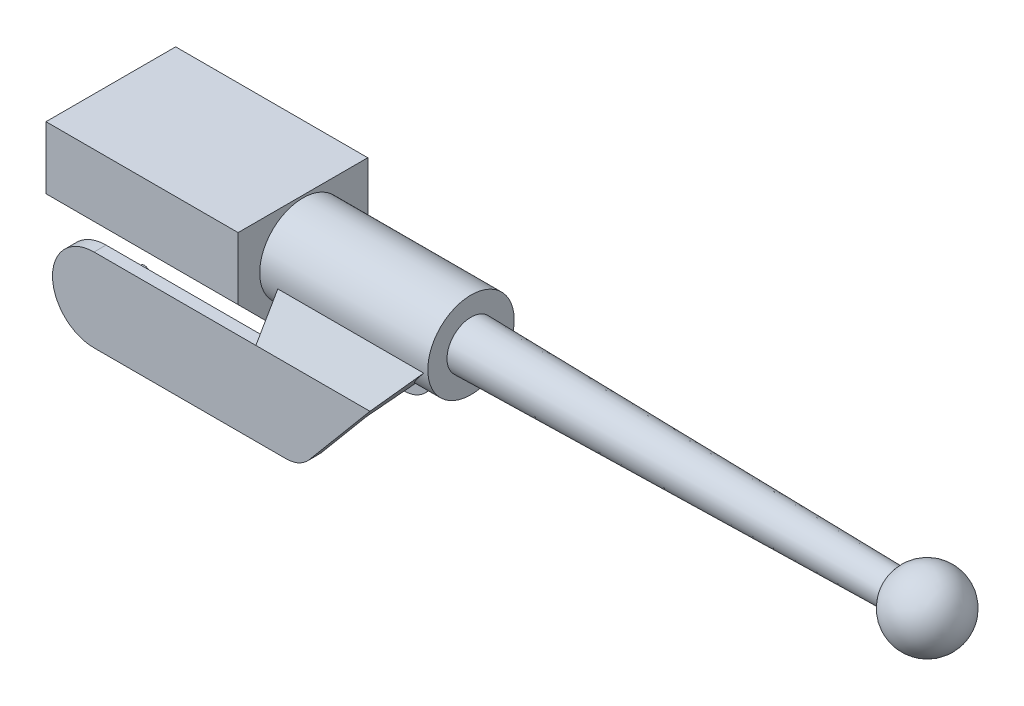
ISO-10303-21;
HEADER;
FILE_DESCRIPTION(('STEP AP214'),'2;1');
FILE_NAME('part.step','',(''),(''),'','','');
FILE_SCHEMA(('AUTOMOTIVE_DESIGN { 1 0 10303 214 1 1 1 1 }'));
ENDSEC;
DATA;
#1=APPLICATION_CONTEXT('core data for automotive mechanical design processes');
#2=APPLICATION_PROTOCOL_DEFINITION('international standard','automotive_design',2000,#1);
#3=PRODUCT_CONTEXT('',#1,'mechanical');
#4=PRODUCT('Part','Part','',(#3));
#5=PRODUCT_RELATED_PRODUCT_CATEGORY('part','',(#4));
#6=PRODUCT_DEFINITION_FORMATION('','',#4);
#7=PRODUCT_DEFINITION_CONTEXT('part definition',#1,'design');
#8=PRODUCT_DEFINITION('design','',#6,#7);
#9=PRODUCT_DEFINITION_SHAPE('','',#8);
#10=(LENGTH_UNIT() NAMED_UNIT(*) SI_UNIT(.MILLI.,.METRE.));
#11=(NAMED_UNIT(*) PLANE_ANGLE_UNIT() SI_UNIT($,.RADIAN.));
#12=(NAMED_UNIT(*) SI_UNIT($,.STERADIAN.) SOLID_ANGLE_UNIT());
#13=UNCERTAINTY_MEASURE_WITH_UNIT(LENGTH_MEASURE(1.E-05),#10,'distance_accuracy_value','');
#14=(GEOMETRIC_REPRESENTATION_CONTEXT(3) GLOBAL_UNCERTAINTY_ASSIGNED_CONTEXT((#13)) GLOBAL_UNIT_ASSIGNED_CONTEXT((#10,
#11,#12)) REPRESENTATION_CONTEXT('',''));
#15=CARTESIAN_POINT('',(0.,0.,0.));
#16=DIRECTION('',(0.,0.,1.));
#17=DIRECTION('',(1.,0.,0.));
#18=AXIS2_PLACEMENT_3D('',#15,#16,#17);
#19=CARTESIAN_POINT('',(-750.,-127.283333109177,110.));
#20=DIRECTION('',(0.,0.,1.));
#21=DIRECTION('',(0.,-1.,0.));
#22=AXIS2_PLACEMENT_3D('',#19,#20,#21);
#23=PLANE('',#22);
#24=CARTESIAN_POINT('',(-250.,-200.,110.));
#25=DIRECTION('',(0.,0.,1.));
#26=DIRECTION('',(0.,-1.,0.));
#27=AXIS2_PLACEMENT_3D('',#24,#25,#26);
#28=CIRCLE('',#27,62.953588842435);
#29=CARTESIAN_POINT('',(-250.,-262.953588842435,110.));
#30=VERTEX_POINT('',#29);
#31=CARTESIAN_POINT('',(-201.774753092856,-240.465786893218,110.));
#32=VERTEX_POINT('',#31);
#33=EDGE_CURVE('E225',#30,#32,#28,.T.);
#34=ORIENTED_EDGE('',*,*,#33,.F.);
#35=DIRECTION('',(-1.,0.,0.));
#36=VECTOR('',#35,1.);
#37=CARTESIAN_POINT('',(-250.,-262.953588842435,110.));
#38=LINE('',#37,#36);
#39=CARTESIAN_POINT('',(-650.,-262.953588842435,110.));
#40=VERTEX_POINT('',#39);
#41=EDGE_CURVE('E213',#30,#40,#38,.T.);
#42=ORIENTED_EDGE('',*,*,#41,.T.);
#43=CARTESIAN_POINT('',(-650.,-176.476794421218,110.));
#44=DIRECTION('',(0.,0.,1.));
#45=DIRECTION('',(0.,-1.,0.));
#46=AXIS2_PLACEMENT_3D('',#43,#44,#45);
#47=CIRCLE('',#46,86.4767944212173);
#48=CARTESIAN_POINT('',(-650.,-90.,110.));
#49=VERTEX_POINT('',#48);
#50=EDGE_CURVE('E367',#40,#49,#47,.F.);
#51=ORIENTED_EDGE('',*,*,#50,.T.);
#52=DIRECTION('',(1.,0.,0.));
#53=VECTOR('',#52,1.);
#54=CARTESIAN_POINT('',(-650.,-90.,110.));
#55=LINE('',#54,#53);
#56=CARTESIAN_POINT('',(-312.953588842435,-90.,110.));
#57=VERTEX_POINT('',#56);
#58=EDGE_CURVE('E196',#49,#57,#55,.T.);
#59=ORIENTED_EDGE('',*,*,#58,.T.);
#60=DIRECTION('',(0.,-1.,0.));
#61=VECTOR('',#60,1.);
#62=CARTESIAN_POINT('',(-312.953588842435,0.,110.));
#63=LINE('',#62,#61);
#64=CARTESIAN_POINT('',(-312.953588842435,-127.283333109177,110.));
#65=VERTEX_POINT('',#64);
#66=EDGE_CURVE('E52',#57,#65,#63,.T.);
#67=ORIENTED_EDGE('',*,*,#66,.T.);
#68=DIRECTION('',(1.,0.,0.));
#69=VECTOR('',#68,1.);
#70=CARTESIAN_POINT('',(-750.,-127.283333109177,110.));
#71=LINE('',#70,#69);
#72=CARTESIAN_POINT('',(-106.803397866926,-127.283333109177,110.));
#73=VERTEX_POINT('',#72);
#74=EDGE_CURVE('E216',#65,#73,#71,.T.);
#75=ORIENTED_EDGE('',*,*,#74,.T.);
#76=DIRECTION('',(0.642787609686544,0.766044443118975,0.));
#77=VECTOR('',#76,1.);
#78=CARTESIAN_POINT('',(-201.774753092856,-240.465786893218,110.));
#79=LINE('',#78,#77);
#80=EDGE_CURVE('E227',#32,#73,#79,.T.);
#81=ORIENTED_EDGE('',*,*,#80,.F.);
#82=EDGE_LOOP('',(#34,#42,#51,#59,#67,#75,#81));
#83=FACE_BOUND('',#82,.T.);
#84=CARTESIAN_POINT('',(-650.,-176.476794421218,110.));
#85=DIRECTION('',(0.,0.,1.));
#86=DIRECTION('',(1.,0.,0.));
#87=AXIS2_PLACEMENT_3D('',#84,#85,#86);
#88=CIRCLE('',#87,10.);
#89=CARTESIAN_POINT('',(-640.,-176.476794421218,110.));
#90=VERTEX_POINT('',#89);
#91=EDGE_CURVE('E373',#90,#90,#88,.T.);
#92=ORIENTED_EDGE('',*,*,#91,.T.);
#93=EDGE_LOOP('',(#92));
#94=FACE_BOUND('',#93,.T.);
#95=CARTESIAN_POINT('',(-250.,-200.,110.));
#96=DIRECTION('',(0.,0.,1.));
#97=DIRECTION('',(0.,-1.,0.));
#98=AXIS2_PLACEMENT_3D('',#95,#96,#97);
#99=CIRCLE('',#98,15.);
#100=CARTESIAN_POINT('',(-250.,-215.,110.));
#101=VERTEX_POINT('',#100);
#102=EDGE_CURVE('E12',#101,#101,#99,.F.);
#103=ORIENTED_EDGE('',*,*,#102,.F.);
#104=EDGE_LOOP('',(#103));
#105=FACE_BOUND('',#104,.T.);
#106=ADVANCED_FACE('F36',(#83,#94,#105),#23,.F.);
#107=CARTESIAN_POINT('',(0.,0.,0.));
#108=DIRECTION('',(1.,0.,0.));
#109=DIRECTION('',(0.,0.,-1.));
#110=AXIS2_PLACEMENT_3D('',#107,#108,#109);
#111=PLANE('',#110);
#112=CARTESIAN_POINT('',(0.,0.,0.));
#113=DIRECTION('',(1.,0.,0.));
#114=DIRECTION('',(0.,0.,-1.));
#115=AXIS2_PLACEMENT_3D('',#112,#113,#114);
#116=CIRCLE('',#115,90.);
#117=CARTESIAN_POINT('',(0.,0.,-90.));
#118=VERTEX_POINT('',#117);
#119=EDGE_CURVE('E311',#118,#118,#116,.T.);
#120=ORIENTED_EDGE('',*,*,#119,.T.);
#121=EDGE_LOOP('',(#120));
#122=FACE_BOUND('',#121,.T.);
#123=CARTESIAN_POINT('',(0.,0.,0.));
#124=DIRECTION('',(1.,0.,0.));
#125=DIRECTION('',(0.,0.,-1.));
#126=AXIS2_PLACEMENT_3D('',#123,#124,#125);
#127=CIRCLE('',#126,50.);
#128=CARTESIAN_POINT('',(0.,0.,-50.));
#129=VERTEX_POINT('',#128);
#130=EDGE_CURVE('E189',#129,#129,#127,.T.);
#131=ORIENTED_EDGE('',*,*,#130,.F.);
#132=EDGE_LOOP('',(#131));
#133=FACE_BOUND('',#132,.T.);
#134=ADVANCED_FACE('F399',(#122,#133),#111,.T.);
#135=CARTESIAN_POINT('',(-350.,0.,0.));
#136=DIRECTION('',(1.,0.,0.));
#137=DIRECTION('',(0.,0.,-1.));
#138=AXIS2_PLACEMENT_3D('',#135,#136,#137);
#139=CYLINDRICAL_SURFACE('',#138,90.);
#140=DIRECTION('',(1.,0.,0.));
#141=VECTOR('',#140,1.);
#142=CARTESIAN_POINT('',(-350.,-10.9084534613157,89.3364743152667));
#143=LINE('',#142,#141);
#144=CARTESIAN_POINT('',(-9.15327927610456,-10.9084534613157,89.3364743152667));
#145=VERTEX_POINT('',#144);
#146=CARTESIAN_POINT('',(-312.953588842435,-10.9084534613157,89.3364743152667));
#147=VERTEX_POINT('',#146);
#148=EDGE_CURVE('E274',#145,#147,#143,.F.);
#149=ORIENTED_EDGE('',*,*,#148,.F.);
#150=CARTESIAN_POINT('',(0.,0.,0.));
#151=DIRECTION('',(-0.766044443118975,0.642787609686543,0.));
#152=DIRECTION('',(0.642787609686544,0.766044443118975,0.));
#153=AXIS2_PLACEMENT_3D('',#150,#151,#152);
#154=ELLIPSE('',#153,117.486656039906,90.);
#155=CARTESIAN_POINT('',(-60.1565780546724,-71.6918180148291,54.4084849056526));
#156=VERTEX_POINT('',#155);
#157=EDGE_CURVE('E281',#145,#156,#154,.F.);
#158=ORIENTED_EDGE('',*,*,#157,.T.);
#159=DIRECTION('',(1.,0.,0.));
#160=VECTOR('',#159,1.);
#161=CARTESIAN_POINT('',(-350.,-71.6918180148291,54.4084849056526));
#162=LINE('',#161,#160);
#163=CARTESIAN_POINT('',(-312.953588842435,-71.6918180148291,54.4084849056526));
#164=VERTEX_POINT('',#163);
#165=EDGE_CURVE('E338',#156,#164,#162,.F.);
#166=ORIENTED_EDGE('',*,*,#165,.T.);
#167=CARTESIAN_POINT('',(-312.953588842435,0.,0.));
#168=DIRECTION('',(1.,0.,0.));
#169=DIRECTION('',(0.,0.,-1.));
#170=AXIS2_PLACEMENT_3D('',#167,#168,#169);
#171=CIRCLE('',#170,90.);
#172=EDGE_CURVE('E45',#164,#147,#171,.F.);
#173=ORIENTED_EDGE('',*,*,#172,.T.);
#174=EDGE_LOOP('',(#149,#158,#166,#173));
#175=FACE_BOUND('',#174,.T.);
#176=DIRECTION('',(1.,0.,0.));
#177=VECTOR('',#176,1.);
#178=CARTESIAN_POINT('',(-350.,-10.9084534613157,-89.3364743152667));
#179=LINE('',#178,#177);
#180=CARTESIAN_POINT('',(-312.953588842435,-10.9084534613157,-89.3364743152667));
#181=VERTEX_POINT('',#180);
#182=CARTESIAN_POINT('',(-9.15327927610464,-10.9084534613157,-89.3364743152667));
#183=VERTEX_POINT('',#182);
#184=EDGE_CURVE('E276',#181,#183,#179,.T.);
#185=ORIENTED_EDGE('',*,*,#184,.F.);
#186=CARTESIAN_POINT('',(-312.953588842435,-74.3017038301033,-50.7863840802199));
#187=VERTEX_POINT('',#186);
#188=EDGE_CURVE('E335',#181,#187,#171,.F.);
#189=ORIENTED_EDGE('',*,*,#188,.T.);
#190=DIRECTION('',(1.,0.,0.));
#191=VECTOR('',#190,1.);
#192=CARTESIAN_POINT('',(-350.,-74.3017038301033,-50.7863840802199));
#193=LINE('',#192,#191);
#194=CARTESIAN_POINT('',(-62.3465322796838,-74.3017038301033,-50.7863840802199));
#195=VERTEX_POINT('',#194);
#196=EDGE_CURVE('E332',#187,#195,#193,.T.);
#197=ORIENTED_EDGE('',*,*,#196,.T.);
#198=EDGE_CURVE('E278',#195,#183,#154,.F.);
#199=ORIENTED_EDGE('',*,*,#198,.T.);
#200=EDGE_LOOP('',(#185,#189,#197,#199));
#201=FACE_BOUND('',#200,.T.);
#202=CARTESIAN_POINT('',(-350.,0.,0.));
#203=DIRECTION('',(1.,0.,0.));
#204=DIRECTION('',(0.,0.,-1.));
#205=AXIS2_PLACEMENT_3D('',#202,#203,#204);
#206=CIRCLE('',#205,90.);
#207=CARTESIAN_POINT('',(-350.,0.,-90.));
#208=VERTEX_POINT('',#207);
#209=EDGE_CURVE('E308',#208,#208,#206,.F.);
#210=ORIENTED_EDGE('',*,*,#209,.F.);
#211=EDGE_LOOP('',(#210));
#212=FACE_BOUND('',#211,.T.);
#213=ORIENTED_EDGE('',*,*,#119,.F.);
#214=EDGE_LOOP('',(#213));
#215=FACE_BOUND('',#214,.T.);
#216=ADVANCED_FACE('F345',(#175,#201,#212,#215),#139,.T.);
#217=CARTESIAN_POINT('',(-750.,-95.,135.));
#218=DIRECTION('',(0.,0.,-1.));
#219=DIRECTION('',(-1.,0.,0.));
#220=AXIS2_PLACEMENT_3D('',#217,#218,#219);
#221=PLANE('',#220);
#222=DIRECTION('',(0.,1.,0.));
#223=VECTOR('',#222,1.);
#224=CARTESIAN_POINT('',(-750.,-95.,135.));
#225=LINE('',#224,#223);
#226=CARTESIAN_POINT('',(-750.,-35.,135.));
#227=VERTEX_POINT('',#226);
#228=CARTESIAN_POINT('',(-750.,95.,135.));
#229=VERTEX_POINT('',#228);
#230=EDGE_CURVE('E282',#227,#229,#225,.T.);
#231=ORIENTED_EDGE('',*,*,#230,.F.);
#232=DIRECTION('',(1.,0.,0.));
#233=VECTOR('',#232,1.);
#234=CARTESIAN_POINT('',(-750.,-35.,135.));
#235=LINE('',#234,#233);
#236=CARTESIAN_POINT('',(-350.,-35.,135.));
#237=VERTEX_POINT('',#236);
#238=EDGE_CURVE('E329',#227,#237,#235,.T.);
#239=ORIENTED_EDGE('',*,*,#238,.T.);
#240=DIRECTION('',(0.,1.,0.));
#241=VECTOR('',#240,1.);
#242=CARTESIAN_POINT('',(-350.,-95.,135.));
#243=LINE('',#242,#241);
#244=CARTESIAN_POINT('',(-350.,95.,135.));
#245=VERTEX_POINT('',#244);
#246=EDGE_CURVE('E294',#237,#245,#243,.T.);
#247=ORIENTED_EDGE('',*,*,#246,.T.);
#248=DIRECTION('',(1.,0.,0.));
#249=VECTOR('',#248,1.);
#250=CARTESIAN_POINT('',(-750.,95.,135.));
#251=LINE('',#250,#249);
#252=EDGE_CURVE('E305',#229,#245,#251,.T.);
#253=ORIENTED_EDGE('',*,*,#252,.F.);
#254=EDGE_LOOP('',(#231,#239,#247,#253));
#255=FACE_BOUND('',#254,.T.);
#256=ADVANCED_FACE('F462',(#255),#221,.F.);
#257=CARTESIAN_POINT('',(-750.,95.,-135.));
#258=DIRECTION('',(0.,-1.,0.));
#259=DIRECTION('',(0.,0.,-1.));
#260=AXIS2_PLACEMENT_3D('',#257,#258,#259);
#261=PLANE('',#260);
#262=DIRECTION('',(0.,0.,-1.));
#263=VECTOR('',#262,1.);
#264=CARTESIAN_POINT('',(-350.,95.,-135.));
#265=LINE('',#264,#263);
#266=CARTESIAN_POINT('',(-350.,95.,-135.));
#267=VERTEX_POINT('',#266);
#268=EDGE_CURVE('E296',#245,#267,#265,.T.);
#269=ORIENTED_EDGE('',*,*,#268,.T.);
#270=DIRECTION('',(1.,0.,0.));
#271=VECTOR('',#270,1.);
#272=CARTESIAN_POINT('',(-750.,95.,-135.));
#273=LINE('',#272,#271);
#274=CARTESIAN_POINT('',(-750.,95.,-135.));
#275=VERTEX_POINT('',#274);
#276=EDGE_CURVE('E293',#275,#267,#273,.T.);
#277=ORIENTED_EDGE('',*,*,#276,.F.);
#278=DIRECTION('',(0.,0.,-1.));
#279=VECTOR('',#278,1.);
#280=CARTESIAN_POINT('',(-750.,95.,-135.));
#281=LINE('',#280,#279);
#282=EDGE_CURVE('E284',#229,#275,#281,.T.);
#283=ORIENTED_EDGE('',*,*,#282,.F.);
#284=ORIENTED_EDGE('',*,*,#252,.T.);
#285=EDGE_LOOP('',(#269,#277,#283,#284));
#286=FACE_BOUND('',#285,.T.);
#287=ADVANCED_FACE('F458',(#286),#261,.F.);
#288=CARTESIAN_POINT('',(-750.,-95.,-135.));
#289=DIRECTION('',(0.,0.,1.));
#290=DIRECTION('',(1.,0.,0.));
#291=AXIS2_PLACEMENT_3D('',#288,#289,#290);
#292=PLANE('',#291);
#293=DIRECTION('',(0.,-1.,0.));
#294=VECTOR('',#293,1.);
#295=CARTESIAN_POINT('',(-350.,-95.,-135.));
#296=LINE('',#295,#294);
#297=CARTESIAN_POINT('',(-350.,-35.,-135.));
#298=VERTEX_POINT('',#297);
#299=EDGE_CURVE('E298',#267,#298,#296,.T.);
#300=ORIENTED_EDGE('',*,*,#299,.T.);
#301=DIRECTION('',(-1.,0.,0.));
#302=VECTOR('',#301,1.);
#303=CARTESIAN_POINT('',(-750.,-35.,-135.));
#304=LINE('',#303,#302);
#305=CARTESIAN_POINT('',(-750.,-35.,-135.));
#306=VERTEX_POINT('',#305);
#307=EDGE_CURVE('E323',#298,#306,#304,.T.);
#308=ORIENTED_EDGE('',*,*,#307,.T.);
#309=DIRECTION('',(0.,-1.,0.));
#310=VECTOR('',#309,1.);
#311=CARTESIAN_POINT('',(-750.,-95.,-135.));
#312=LINE('',#311,#310);
#313=EDGE_CURVE('E287',#275,#306,#312,.T.);
#314=ORIENTED_EDGE('',*,*,#313,.F.);
#315=ORIENTED_EDGE('',*,*,#276,.T.);
#316=EDGE_LOOP('',(#300,#308,#314,#315));
#317=FACE_BOUND('',#316,.T.);
#318=ADVANCED_FACE('F454',(#317),#292,.F.);
#319=CARTESIAN_POINT('',(-750.,-95.,-135.));
#320=DIRECTION('',(0.,1.,0.));
#321=DIRECTION('',(0.,0.,1.));
#322=AXIS2_PLACEMENT_3D('',#319,#320,#321);
#323=PLANE('',#322);
#324=DIRECTION('',(0.,0.,1.));
#325=VECTOR('',#324,1.);
#326=CARTESIAN_POINT('',(-750.,-95.,-135.));
#327=LINE('',#326,#325);
#328=CARTESIAN_POINT('',(-750.,-95.,-75.));
#329=VERTEX_POINT('',#328);
#330=CARTESIAN_POINT('',(-750.,-95.,75.));
#331=VERTEX_POINT('',#330);
#332=EDGE_CURVE('E290',#329,#331,#327,.T.);
#333=ORIENTED_EDGE('',*,*,#332,.F.);
#334=DIRECTION('',(1.,0.,0.));
#335=VECTOR('',#334,1.);
#336=CARTESIAN_POINT('',(-750.,-95.,-75.));
#337=LINE('',#336,#335);
#338=CARTESIAN_POINT('',(-350.,-95.,-75.));
#339=VERTEX_POINT('',#338);
#340=EDGE_CURVE('E316',#329,#339,#337,.T.);
#341=ORIENTED_EDGE('',*,*,#340,.T.);
#342=DIRECTION('',(0.,0.,1.));
#343=VECTOR('',#342,1.);
#344=CARTESIAN_POINT('',(-350.,-95.,-135.));
#345=LINE('',#344,#343);
#346=CARTESIAN_POINT('',(-350.,-95.,75.));
#347=VERTEX_POINT('',#346);
#348=EDGE_CURVE('E285',#339,#347,#345,.T.);
#349=ORIENTED_EDGE('',*,*,#348,.T.);
#350=DIRECTION('',(-1.,0.,0.));
#351=VECTOR('',#350,1.);
#352=CARTESIAN_POINT('',(-750.,-95.,75.));
#353=LINE('',#352,#351);
#354=EDGE_CURVE('E314',#347,#331,#353,.T.);
#355=ORIENTED_EDGE('',*,*,#354,.T.);
#356=EDGE_LOOP('',(#333,#341,#349,#355));
#357=FACE_BOUND('',#356,.T.);
#358=ADVANCED_FACE('F446',(#357),#323,.F.);
#359=CARTESIAN_POINT('',(-750.,95.,135.));
#360=DIRECTION('',(1.,0.,0.));
#361=DIRECTION('',(0.,0.,-1.));
#362=AXIS2_PLACEMENT_3D('',#359,#360,#361);
#363=PLANE('',#362);
#364=ORIENTED_EDGE('',*,*,#313,.T.);
#365=DIRECTION('',(0.,0.707106781186549,-0.707106781186546));
#366=VECTOR('',#365,1.);
#367=CARTESIAN_POINT('',(-750.,-95.,-75.));
#368=LINE('',#367,#366);
#369=EDGE_CURVE('E327',#306,#329,#368,.F.);
#370=ORIENTED_EDGE('',*,*,#369,.T.);
#371=ORIENTED_EDGE('',*,*,#332,.T.);
#372=DIRECTION('',(0.,-0.707106781186546,-0.707106781186549));
#373=VECTOR('',#372,1.);
#374=CARTESIAN_POINT('',(-750.,-35.,135.));
#375=LINE('',#374,#373);
#376=EDGE_CURVE('E325',#331,#227,#375,.F.);
#377=ORIENTED_EDGE('',*,*,#376,.T.);
#378=ORIENTED_EDGE('',*,*,#230,.T.);
#379=ORIENTED_EDGE('',*,*,#282,.T.);
#380=EDGE_LOOP('',(#364,#370,#371,#377,#378,#379));
#381=FACE_BOUND('',#380,.T.);
#382=ADVANCED_FACE('F442',(#381),#363,.F.);
#383=CARTESIAN_POINT('',(-350.,95.,135.));
#384=DIRECTION('',(1.,0.,0.));
#385=DIRECTION('',(0.,0.,-1.));
#386=AXIS2_PLACEMENT_3D('',#383,#384,#385);
#387=PLANE('',#386);
#388=ORIENTED_EDGE('',*,*,#209,.T.);
#389=EDGE_LOOP('',(#388));
#390=FACE_BOUND('',#389,.T.);
#391=ORIENTED_EDGE('',*,*,#348,.F.);
#392=DIRECTION('',(0.,-0.707106781186549,0.707106781186546));
#393=VECTOR('',#392,1.);
#394=CARTESIAN_POINT('',(-350.,-105.,-65.));
#395=LINE('',#394,#393);
#396=EDGE_CURVE('E321',#339,#298,#395,.F.);
#397=ORIENTED_EDGE('',*,*,#396,.T.);
#398=ORIENTED_EDGE('',*,*,#299,.F.);
#399=ORIENTED_EDGE('',*,*,#268,.F.);
#400=ORIENTED_EDGE('',*,*,#246,.F.);
#401=DIRECTION('',(0.,0.707106781186546,0.707106781186549));
#402=VECTOR('',#401,1.);
#403=CARTESIAN_POINT('',(-350.,30.,200.));
#404=LINE('',#403,#402);
#405=EDGE_CURVE('E319',#237,#347,#404,.F.);
#406=ORIENTED_EDGE('',*,*,#405,.T.);
#407=EDGE_LOOP('',(#391,#397,#398,#399,#400,#406));
#408=FACE_BOUND('',#407,.T.);
#409=ADVANCED_FACE('F445',(#390,#408),#387,.T.);
#410=CARTESIAN_POINT('',(-750.,-95.,-75.));
#411=DIRECTION('',(0.,0.707106781186546,0.707106781186549));
#412=DIRECTION('',(0.,-0.707106781186549,0.707106781186546));
#413=AXIS2_PLACEMENT_3D('',#410,#411,#412);
#414=PLANE('',#413);
#415=ORIENTED_EDGE('',*,*,#369,.F.);
#416=ORIENTED_EDGE('',*,*,#307,.F.);
#417=ORIENTED_EDGE('',*,*,#396,.F.);
#418=ORIENTED_EDGE('',*,*,#340,.F.);
#419=EDGE_LOOP('',(#415,#416,#417,#418));
#420=FACE_BOUND('',#419,.T.);
#421=ADVANCED_FACE('F450',(#420),#414,.F.);
#422=CARTESIAN_POINT('',(-750.,-35.,135.));
#423=DIRECTION('',(0.,0.707106781186549,-0.707106781186546));
#424=DIRECTION('',(0.,0.707106781186546,0.707106781186549));
#425=AXIS2_PLACEMENT_3D('',#422,#423,#424);
#426=PLANE('',#425);
#427=ORIENTED_EDGE('',*,*,#376,.F.);
#428=ORIENTED_EDGE('',*,*,#354,.F.);
#429=ORIENTED_EDGE('',*,*,#405,.F.);
#430=ORIENTED_EDGE('',*,*,#238,.F.);
#431=EDGE_LOOP('',(#427,#428,#429,#430));
#432=FACE_BOUND('',#431,.T.);
#433=ADVANCED_FACE('F415',(#432),#426,.F.);
#434=CARTESIAN_POINT('',(-750.,-133.515319749884,-110.));
#435=DIRECTION('',(0.,0.707106781186544,-0.707106781186551));
#436=DIRECTION('',(0.,0.707106781186551,0.707106781186544));
#437=AXIS2_PLACEMENT_3D('',#434,#435,#436);
#438=PLANE('',#437);
#439=ORIENTED_EDGE('',*,*,#196,.F.);
#440=DIRECTION('',(0.,0.707106781186551,0.707106781186544));
#441=VECTOR('',#440,1.);
#442=CARTESIAN_POINT('',(-312.953588842435,55.7423401250586,79.2576598749407));
#443=LINE('',#442,#441);
#444=CARTESIAN_POINT('',(-312.953588842435,-133.515319749884,-110.));
#445=VERTEX_POINT('',#444);
#446=EDGE_CURVE('E266',#445,#187,#443,.T.);
#447=ORIENTED_EDGE('',*,*,#446,.F.);
#448=DIRECTION('',(1.,0.,0.));
#449=VECTOR('',#448,1.);
#450=CARTESIAN_POINT('',(-750.,-133.515319749884,-110.));
#451=LINE('',#450,#449);
#452=CARTESIAN_POINT('',(-112.032655558646,-133.515319749884,-110.));
#453=VERTEX_POINT('',#452);
#454=EDGE_CURVE('E215',#445,#453,#451,.T.);
#455=ORIENTED_EDGE('',*,*,#454,.T.);
#456=DIRECTION('',(-0.510273605374743,-0.608120402411344,-0.608120402411337));
#457=VECTOR('',#456,1.);
#458=CARTESIAN_POINT('',(-92.5617813595415,-110.310835472152,-86.7955157222684));
#459=LINE('',#458,#457);
#460=EDGE_CURVE('E218',#195,#453,#459,.T.);
#461=ORIENTED_EDGE('',*,*,#460,.F.);
#462=EDGE_LOOP('',(#439,#447,#455,#461));
#463=FACE_BOUND('',#462,.T.);
#464=ADVANCED_FACE('F411',(#463),#438,.F.);
#465=CARTESIAN_POINT('',(-750.,-133.515319749884,-110.));
#466=DIRECTION('',(0.,0.,-1.));
#467=DIRECTION('',(0.,1.,0.));
#468=AXIS2_PLACEMENT_3D('',#465,#466,#467);
#469=PLANE('',#468);
#470=CARTESIAN_POINT('',(-250.,-200.,-110.));
#471=DIRECTION('',(0.,0.,-1.));
#472=DIRECTION('',(-1.,0.,0.));
#473=AXIS2_PLACEMENT_3D('',#470,#471,#472);
#474=CIRCLE('',#473,15.);
#475=CARTESIAN_POINT('',(-265.,-200.,-110.));
#476=VERTEX_POINT('',#475);
#477=EDGE_CURVE('E380',#476,#476,#474,.T.);
#478=ORIENTED_EDGE('',*,*,#477,.T.);
#479=EDGE_LOOP('',(#478));
#480=FACE_BOUND('',#479,.T.);
#481=ORIENTED_EDGE('',*,*,#454,.F.);
#482=DIRECTION('',(0.,1.,0.));
#483=VECTOR('',#482,1.);
#484=CARTESIAN_POINT('',(-312.953588842435,0.,-110.));
#485=LINE('',#484,#483);
#486=CARTESIAN_POINT('',(-312.953588842435,-200.,-110.));
#487=VERTEX_POINT('',#486);
#488=EDGE_CURVE('E271',#487,#445,#485,.T.);
#489=ORIENTED_EDGE('',*,*,#488,.F.);
#490=CARTESIAN_POINT('',(-250.,-200.,-110.));
#491=DIRECTION('',(0.,0.,-1.));
#492=DIRECTION('',(0.,1.,0.));
#493=AXIS2_PLACEMENT_3D('',#490,#491,#492);
#494=CIRCLE('',#493,62.953588842435);
#495=CARTESIAN_POINT('',(-201.774753092856,-240.465786893218,-110.));
#496=VERTEX_POINT('',#495);
#497=EDGE_CURVE('E230',#496,#487,#494,.T.);
#498=ORIENTED_EDGE('',*,*,#497,.F.);
#499=DIRECTION('',(-0.642787609686544,-0.766044443118975,0.));
#500=VECTOR('',#499,1.);
#501=CARTESIAN_POINT('',(-201.774753092856,-240.465786893218,-110.));
#502=LINE('',#501,#500);
#503=EDGE_CURVE('E232',#453,#496,#502,.T.);
#504=ORIENTED_EDGE('',*,*,#503,.F.);
#505=EDGE_LOOP('',(#481,#489,#498,#504));
#506=FACE_BOUND('',#505,.T.);
#507=ADVANCED_FACE('F414',(#480,#506),#469,.F.);
#508=CARTESIAN_POINT('',(0.,0.,-83.0384757729337));
#509=DIRECTION('',(0.,-0.5,0.86602540378444));
#510=DIRECTION('',(0.,-0.86602540378444,-0.5));
#511=AXIS2_PLACEMENT_3D('',#508,#509,#510);
#512=PLANE('',#511);
#513=DIRECTION('',(0.,0.86602540378444,0.5));
#514=VECTOR('',#513,1.);
#515=CARTESIAN_POINT('',(-312.953588842435,0.,-83.0384757729337));
#516=LINE('',#515,#514);
#517=CARTESIAN_POINT('',(-312.953588842435,-90.,-135.));
#518=VERTEX_POINT('',#517);
#519=EDGE_CURVE('E256',#181,#518,#516,.F.);
#520=ORIENTED_EDGE('',*,*,#519,.F.);
#521=ORIENTED_EDGE('',*,*,#184,.T.);
#522=DIRECTION('',(-0.58785888315256,-0.700582935935475,-0.404481746652002));
#523=VECTOR('',#522,1.);
#524=CARTESIAN_POINT('',(0.,0.,-83.0384757729337));
#525=LINE('',#524,#523);
#526=CARTESIAN_POINT('',(-75.5189668059561,-90.,-135.));
#527=VERTEX_POINT('',#526);
#528=EDGE_CURVE('E262',#527,#183,#525,.F.);
#529=ORIENTED_EDGE('',*,*,#528,.F.);
#530=DIRECTION('',(1.,0.,0.));
#531=VECTOR('',#530,1.);
#532=CARTESIAN_POINT('',(-250.,-90.,-135.));
#533=LINE('',#532,#531);
#534=EDGE_CURVE('E258',#518,#527,#533,.T.);
#535=ORIENTED_EDGE('',*,*,#534,.F.);
#536=EDGE_LOOP('',(#520,#521,#529,#535));
#537=FACE_BOUND('',#536,.T.);
#538=ADVANCED_FACE('F419',(#537),#512,.F.);
#539=CARTESIAN_POINT('',(-250.,-200.,-135.));
#540=DIRECTION('',(0.,0.,1.));
#541=DIRECTION('',(1.,0.,0.));
#542=AXIS2_PLACEMENT_3D('',#539,#540,#541);
#543=PLANE('',#542);
#544=DIRECTION('',(0.,-1.,0.));
#545=VECTOR('',#544,1.);
#546=CARTESIAN_POINT('',(-312.953588842435,0.,-135.));
#547=LINE('',#546,#545);
#548=CARTESIAN_POINT('',(-312.953588842435,-200.,-135.));
#549=VERTEX_POINT('',#548);
#550=EDGE_CURVE('E238',#518,#549,#547,.T.);
#551=ORIENTED_EDGE('',*,*,#550,.F.);
#552=ORIENTED_EDGE('',*,*,#534,.T.);
#553=DIRECTION('',(0.642787609686543,0.766044443118975,0.));
#554=VECTOR('',#553,1.);
#555=CARTESIAN_POINT('',(-201.774753092856,-240.465786893218,-135.));
#556=LINE('',#555,#554);
#557=CARTESIAN_POINT('',(-201.774753092856,-240.465786893218,-135.));
#558=VERTEX_POINT('',#557);
#559=EDGE_CURVE('E243',#558,#527,#556,.T.);
#560=ORIENTED_EDGE('',*,*,#559,.F.);
#561=CARTESIAN_POINT('',(-250.,-200.,-135.));
#562=DIRECTION('',(0.,0.,1.));
#563=DIRECTION('',(1.,0.,0.));
#564=AXIS2_PLACEMENT_3D('',#561,#562,#563);
#565=CIRCLE('',#564,62.953588842435);
#566=EDGE_CURVE('E235',#549,#558,#565,.T.);
#567=ORIENTED_EDGE('',*,*,#566,.F.);
#568=EDGE_LOOP('',(#551,#552,#560,#567));
#569=FACE_BOUND('',#568,.T.);
#570=ADVANCED_FACE('F423',(#569),#543,.F.);
#571=CARTESIAN_POINT('',(-201.774753092856,-240.465786893218,135.));
#572=DIRECTION('',(-0.766044443118975,0.642787609686543,0.));
#573=DIRECTION('',(-0.642787609686544,-0.766044443118975,0.));
#574=AXIS2_PLACEMENT_3D('',#571,#572,#573);
#575=PLANE('',#574);
#576=ORIENTED_EDGE('',*,*,#198,.F.);
#577=ORIENTED_EDGE('',*,*,#460,.T.);
#578=ORIENTED_EDGE('',*,*,#503,.T.);
#579=DIRECTION('',(0.,0.,-1.));
#580=VECTOR('',#579,1.);
#581=CARTESIAN_POINT('',(-201.774753092856,-240.465786893218,135.));
#582=LINE('',#581,#580);
#583=EDGE_CURVE('E249',#496,#558,#582,.T.);
#584=ORIENTED_EDGE('',*,*,#583,.T.);
#585=ORIENTED_EDGE('',*,*,#559,.T.);
#586=ORIENTED_EDGE('',*,*,#528,.T.);
#587=EDGE_LOOP('',(#576,#577,#578,#584,#585,#586));
#588=FACE_BOUND('',#587,.T.);
#589=ADVANCED_FACE('F426',(#588),#575,.F.);
#590=CARTESIAN_POINT('',(-250.,-200.,135.));
#591=DIRECTION('',(0.,0.,-1.));
#592=DIRECTION('',(-1.,0.,0.));
#593=AXIS2_PLACEMENT_3D('',#590,#591,#592);
#594=CYLINDRICAL_SURFACE('',#593,62.953588842435);
#595=ORIENTED_EDGE('',*,*,#497,.T.);
#596=DIRECTION('',(0.,0.,-1.));
#597=VECTOR('',#596,1.);
#598=CARTESIAN_POINT('',(-312.953588842435,-200.,135.));
#599=LINE('',#598,#597);
#600=EDGE_CURVE('E240',#487,#549,#599,.T.);
#601=ORIENTED_EDGE('',*,*,#600,.T.);
#602=ORIENTED_EDGE('',*,*,#566,.T.);
#603=ORIENTED_EDGE('',*,*,#583,.F.);
#604=EDGE_LOOP('',(#595,#601,#602,#603));
#605=FACE_BOUND('',#604,.T.);
#606=ADVANCED_FACE('F433',(#605),#594,.T.);
#607=CARTESIAN_POINT('',(-312.953588842435,0.,135.));
#608=DIRECTION('',(1.,0.,0.));
#609=DIRECTION('',(0.,0.,-1.));
#610=AXIS2_PLACEMENT_3D('',#607,#608,#609);
#611=PLANE('',#610);
#612=ORIENTED_EDGE('',*,*,#188,.F.);
#613=ORIENTED_EDGE('',*,*,#519,.T.);
#614=ORIENTED_EDGE('',*,*,#550,.T.);
#615=ORIENTED_EDGE('',*,*,#600,.F.);
#616=ORIENTED_EDGE('',*,*,#488,.T.);
#617=ORIENTED_EDGE('',*,*,#446,.T.);
#618=EDGE_LOOP('',(#612,#613,#614,#615,#616,#617));
#619=FACE_BOUND('',#618,.T.);
#620=ADVANCED_FACE('F430',(#619),#611,.F.);
#621=ORIENTED_EDGE('',*,*,#157,.F.);
#622=DIRECTION('',(-0.58785888315256,-0.700582935935475,0.404481746652002));
#623=VECTOR('',#622,1.);
#624=CARTESIAN_POINT('',(-135.815784898316,-161.858949583569,176.487783885757));
#625=LINE('',#624,#623);
#626=CARTESIAN_POINT('',(-75.5189668059565,-90.,135.));
#627=VERTEX_POINT('',#626);
#628=EDGE_CURVE('E260',#145,#627,#625,.T.);
#629=ORIENTED_EDGE('',*,*,#628,.T.);
#630=DIRECTION('',(0.642787609686543,0.766044443118975,0.));
#631=VECTOR('',#630,1.);
#632=CARTESIAN_POINT('',(-201.774753092856,-240.465786893218,135.));
#633=LINE('',#632,#631);
#634=CARTESIAN_POINT('',(-201.774753092856,-240.465786893218,135.));
#635=VERTEX_POINT('',#634);
#636=EDGE_CURVE('E237',#635,#627,#633,.T.);
#637=ORIENTED_EDGE('',*,*,#636,.F.);
#638=EDGE_CURVE('E250',#635,#32,#582,.T.);
#639=ORIENTED_EDGE('',*,*,#638,.T.);
#640=ORIENTED_EDGE('',*,*,#80,.T.);
#641=DIRECTION('',(0.510273605374743,0.608120402411344,-0.608120402411337));
#642=VECTOR('',#641,1.);
#643=CARTESIAN_POINT('',(-174.411050721157,-207.854996285068,190.57166317589));
#644=LINE('',#643,#642);
#645=EDGE_CURVE('E222',#73,#156,#644,.T.);
#646=ORIENTED_EDGE('',*,*,#645,.T.);
#647=EDGE_LOOP('',(#621,#629,#637,#639,#640,#646));
#648=FACE_BOUND('',#647,.T.);
#649=ADVANCED_FACE('F355',(#648),#575,.F.);
#650=CARTESIAN_POINT('',(-250.,-200.,135.));
#651=DIRECTION('',(0.,0.,1.));
#652=DIRECTION('',(1.,0.,0.));
#653=AXIS2_PLACEMENT_3D('',#650,#651,#652);
#654=CIRCLE('',#653,62.953588842435);
#655=CARTESIAN_POINT('',(-250.,-262.953588842435,135.));
#656=VERTEX_POINT('',#655);
#657=EDGE_CURVE('E60',#656,#635,#654,.T.);
#658=ORIENTED_EDGE('',*,*,#657,.F.);
#659=DIRECTION('',(0.,0.,1.));
#660=VECTOR('',#659,1.);
#661=CARTESIAN_POINT('',(-250.,-262.953588842435,-451.97795054094));
#662=LINE('',#661,#660);
#663=EDGE_CURVE('E208',#30,#656,#662,.T.);
#664=ORIENTED_EDGE('',*,*,#663,.F.);
#665=ORIENTED_EDGE('',*,*,#33,.T.);
#666=ORIENTED_EDGE('',*,*,#638,.F.);
#667=EDGE_LOOP('',(#658,#664,#665,#666));
#668=FACE_BOUND('',#667,.T.);
#669=ADVANCED_FACE('F360',(#668),#594,.T.);
#670=ORIENTED_EDGE('',*,*,#66,.F.);
#671=DIRECTION('',(0.,0.,1.));
#672=VECTOR('',#671,1.);
#673=CARTESIAN_POINT('',(-312.953588842435,-90.,135.));
#674=LINE('',#673,#672);
#675=CARTESIAN_POINT('',(-312.953588842435,-90.,135.));
#676=VERTEX_POINT('',#675);
#677=EDGE_CURVE('E212',#57,#676,#674,.T.);
#678=ORIENTED_EDGE('',*,*,#677,.T.);
#679=DIRECTION('',(0.,0.86602540378444,-0.5));
#680=VECTOR('',#679,1.);
#681=CARTESIAN_POINT('',(-312.953588842435,-90.,135.));
#682=LINE('',#681,#680);
#683=EDGE_CURVE('E253',#676,#147,#682,.T.);
#684=ORIENTED_EDGE('',*,*,#683,.T.);
#685=ORIENTED_EDGE('',*,*,#172,.F.);
#686=DIRECTION('',(0.,-0.707106781186552,0.707106781186544));
#687=VECTOR('',#686,1.);
#688=CARTESIAN_POINT('',(-312.953588842435,-76.1416665545878,58.8583334454114));
#689=LINE('',#688,#687);
#690=EDGE_CURVE('E269',#164,#65,#689,.T.);
#691=ORIENTED_EDGE('',*,*,#690,.T.);
#692=EDGE_LOOP('',(#670,#678,#684,#685,#691));
#693=FACE_BOUND('',#692,.T.);
#694=ADVANCED_FACE('F347',(#693),#611,.F.);
#695=CARTESIAN_POINT('',(-250.,-200.,135.));
#696=DIRECTION('',(0.,0.,1.));
#697=DIRECTION('',(1.,0.,0.));
#698=AXIS2_PLACEMENT_3D('',#695,#696,#697);
#699=PLANE('',#698);
#700=DIRECTION('',(1.,0.,0.));
#701=VECTOR('',#700,1.);
#702=CARTESIAN_POINT('',(-250.,-262.953588842435,135.));
#703=LINE('',#702,#701);
#704=CARTESIAN_POINT('',(-650.,-262.953588842435,135.));
#705=VERTEX_POINT('',#704);
#706=EDGE_CURVE('E200',#705,#656,#703,.T.);
#707=ORIENTED_EDGE('',*,*,#706,.T.);
#708=ORIENTED_EDGE('',*,*,#657,.T.);
#709=ORIENTED_EDGE('',*,*,#636,.T.);
#710=DIRECTION('',(-1.,0.,0.));
#711=VECTOR('',#710,1.);
#712=CARTESIAN_POINT('',(-312.953588842435,-90.,135.));
#713=LINE('',#712,#711);
#714=EDGE_CURVE('E187',#627,#676,#713,.T.);
#715=ORIENTED_EDGE('',*,*,#714,.T.);
#716=DIRECTION('',(-1.,0.,0.));
#717=VECTOR('',#716,1.);
#718=CARTESIAN_POINT('',(-650.,-90.,135.));
#719=LINE('',#718,#717);
#720=CARTESIAN_POINT('',(-650.,-90.,135.));
#721=VERTEX_POINT('',#720);
#722=EDGE_CURVE('E178',#676,#721,#719,.T.);
#723=ORIENTED_EDGE('',*,*,#722,.T.);
#724=CARTESIAN_POINT('',(-650.,-176.476794421218,135.));
#725=DIRECTION('',(0.,0.,1.));
#726=DIRECTION('',(1.,0.,0.));
#727=AXIS2_PLACEMENT_3D('',#724,#725,#726);
#728=CIRCLE('',#727,86.4767944212173);
#729=EDGE_CURVE('E183',#721,#705,#728,.T.);
#730=ORIENTED_EDGE('',*,*,#729,.T.);
#731=EDGE_LOOP('',(#707,#708,#709,#715,#723,#730));
#732=FACE_BOUND('',#731,.T.);
#733=ADVANCED_FACE('F181',(#732),#699,.T.);
#734=CARTESIAN_POINT('',(-250.,-90.,135.));
#735=DIRECTION('',(0.,0.5,0.86602540378444));
#736=DIRECTION('',(0.,-0.86602540378444,0.5));
#737=AXIS2_PLACEMENT_3D('',#734,#735,#736);
#738=PLANE('',#737);
#739=ORIENTED_EDGE('',*,*,#628,.F.);
#740=ORIENTED_EDGE('',*,*,#148,.T.);
#741=ORIENTED_EDGE('',*,*,#683,.F.);
#742=ORIENTED_EDGE('',*,*,#714,.F.);
#743=EDGE_LOOP('',(#739,#740,#741,#742));
#744=FACE_BOUND('',#743,.T.);
#745=ADVANCED_FACE('F352',(#744),#738,.T.);
#746=CARTESIAN_POINT('',(-750.,-127.283333109177,110.));
#747=DIRECTION('',(0.,0.707106781186544,0.707106781186552));
#748=DIRECTION('',(0.,-0.707106781186552,0.707106781186544));
#749=AXIS2_PLACEMENT_3D('',#746,#747,#748);
#750=PLANE('',#749);
#751=ORIENTED_EDGE('',*,*,#165,.F.);
#752=ORIENTED_EDGE('',*,*,#645,.F.);
#753=ORIENTED_EDGE('',*,*,#74,.F.);
#754=ORIENTED_EDGE('',*,*,#690,.F.);
#755=EDGE_LOOP('',(#751,#752,#753,#754));
#756=FACE_BOUND('',#755,.T.);
#757=ADVANCED_FACE('F366',(#756),#750,.F.);
#758=CARTESIAN_POINT('',(-650.,-90.,-451.97795054094));
#759=DIRECTION('',(0.,1.,0.));
#760=DIRECTION('',(-1.,0.,0.));
#761=AXIS2_PLACEMENT_3D('',#758,#759,#760);
#762=PLANE('',#761);
#763=ORIENTED_EDGE('',*,*,#677,.F.);
#764=ORIENTED_EDGE('',*,*,#58,.F.);
#765=DIRECTION('',(0.,0.,1.));
#766=VECTOR('',#765,1.);
#767=CARTESIAN_POINT('',(-650.,-90.,-451.97795054094));
#768=LINE('',#767,#766);
#769=EDGE_CURVE('E193',#49,#721,#768,.T.);
#770=ORIENTED_EDGE('',*,*,#769,.T.);
#771=ORIENTED_EDGE('',*,*,#722,.F.);
#772=EDGE_LOOP('',(#763,#764,#770,#771));
#773=FACE_BOUND('',#772,.T.);
#774=ADVANCED_FACE('F194',(#773),#762,.T.);
#775=CARTESIAN_POINT('',(-250.,-262.953588842435,-451.97795054094));
#776=DIRECTION('',(0.,-1.,0.));
#777=DIRECTION('',(1.,0.,0.));
#778=AXIS2_PLACEMENT_3D('',#775,#776,#777);
#779=PLANE('',#778);
#780=ORIENTED_EDGE('',*,*,#41,.F.);
#781=ORIENTED_EDGE('',*,*,#663,.T.);
#782=ORIENTED_EDGE('',*,*,#706,.F.);
#783=DIRECTION('',(0.,0.,1.));
#784=VECTOR('',#783,1.);
#785=CARTESIAN_POINT('',(-650.,-262.953588842435,-451.97795054094));
#786=LINE('',#785,#784);
#787=EDGE_CURVE('E199',#40,#705,#786,.T.);
#788=ORIENTED_EDGE('',*,*,#787,.F.);
#789=EDGE_LOOP('',(#780,#781,#782,#788));
#790=FACE_BOUND('',#789,.T.);
#791=ADVANCED_FACE('F358',(#790),#779,.T.);
#792=CARTESIAN_POINT('',(-650.,-176.476794421218,-451.97795054094));
#793=DIRECTION('',(0.,0.,1.));
#794=DIRECTION('',(1.,0.,0.));
#795=AXIS2_PLACEMENT_3D('',#792,#793,#794);
#796=CYLINDRICAL_SURFACE('',#795,86.4767944212173);
#797=ORIENTED_EDGE('',*,*,#50,.F.);
#798=ORIENTED_EDGE('',*,*,#787,.T.);
#799=ORIENTED_EDGE('',*,*,#729,.F.);
#800=ORIENTED_EDGE('',*,*,#769,.F.);
#801=EDGE_LOOP('',(#797,#798,#799,#800));
#802=FACE_BOUND('',#801,.T.);
#803=ADVANCED_FACE('F202',(#802),#796,.T.);
#804=CARTESIAN_POINT('',(0.,0.,0.));
#805=DIRECTION('',(-1.,0.,0.));
#806=DIRECTION('',(0.,0.,-1.));
#807=AXIS2_PLACEMENT_3D('',#804,#805,#806);
#808=CONICAL_SURFACE('',#807,50.,0.0174532925199433);
#809=CARTESIAN_POINT('',(883.447260600294,0.,0.));
#810=DIRECTION('',(1.,0.,0.));
#811=DIRECTION('',(0.,0.,-1.));
#812=AXIS2_PLACEMENT_3D('',#809,#810,#811);
#813=CIRCLE('',#812,34.5793707055659);
#814=CARTESIAN_POINT('',(883.447260600294,0.,-34.5793707055659));
#815=VERTEX_POINT('',#814);
#816=EDGE_CURVE('E40',#815,#815,#813,.F.);
#817=ORIENTED_EDGE('',*,*,#816,.T.);
#818=EDGE_LOOP('',(#817));
#819=FACE_BOUND('',#818,.T.);
#820=ORIENTED_EDGE('',*,*,#130,.T.);
#821=EDGE_LOOP('',(#820));
#822=FACE_BOUND('',#821,.T.);
#823=ADVANCED_FACE('F572',(#819,#822),#808,.T.);
#824=CARTESIAN_POINT('',(950.,0.,0.));
#825=DIRECTION('',(1.,0.,0.));
#826=DIRECTION('',(0.,-1.,0.));
#827=AXIS2_PLACEMENT_3D('',#824,#825,#826);
#828=SPHERICAL_SURFACE('',#827,75.);
#829=ORIENTED_EDGE('',*,*,#816,.F.);
#830=EDGE_LOOP('',(#829));
#831=FACE_BOUND('',#830,.T.);
#832=ADVANCED_FACE('F38',(#831),#828,.T.);
#833=CARTESIAN_POINT('',(-650.,-176.476794421218,30.));
#834=DIRECTION('',(0.,0.,1.));
#835=DIRECTION('',(1.,0.,0.));
#836=AXIS2_PLACEMENT_3D('',#833,#834,#835);
#837=CYLINDRICAL_SURFACE('',#836,10.);
#838=CARTESIAN_POINT('',(-650.,-176.476794421218,30.));
#839=DIRECTION('',(0.,0.,1.));
#840=DIRECTION('',(1.,0.,0.));
#841=AXIS2_PLACEMENT_3D('',#838,#839,#840);
#842=CIRCLE('',#841,10.);
#843=CARTESIAN_POINT('',(-640.,-176.476794421218,30.));
#844=VERTEX_POINT('',#843);
#845=EDGE_CURVE('E376',#844,#844,#842,.T.);
#846=ORIENTED_EDGE('',*,*,#845,.T.);
#847=EDGE_LOOP('',(#846));
#848=FACE_BOUND('',#847,.T.);
#849=ORIENTED_EDGE('',*,*,#91,.F.);
#850=EDGE_LOOP('',(#849));
#851=FACE_BOUND('',#850,.T.);
#852=ADVANCED_FACE('F585',(#848,#851),#837,.T.);
#853=CARTESIAN_POINT('',(-650.,-176.476794421218,30.));
#854=DIRECTION('',(0.,0.,1.));
#855=DIRECTION('',(1.,0.,0.));
#856=AXIS2_PLACEMENT_3D('',#853,#854,#855);
#857=PLANE('',#856);
#858=ORIENTED_EDGE('',*,*,#845,.F.);
#859=EDGE_LOOP('',(#858));
#860=FACE_BOUND('',#859,.T.);
#861=ADVANCED_FACE('F591',(#860),#857,.F.);
#862=CARTESIAN_POINT('',(-250.,-200.,-60.));
#863=DIRECTION('',(0.,0.,-1.));
#864=DIRECTION('',(-1.,0.,0.));
#865=AXIS2_PLACEMENT_3D('',#862,#863,#864);
#866=CYLINDRICAL_SURFACE('',#865,15.);
#867=CARTESIAN_POINT('',(-250.,-200.,-60.));
#868=DIRECTION('',(0.,0.,-1.));
#869=DIRECTION('',(-1.,0.,0.));
#870=AXIS2_PLACEMENT_3D('',#867,#868,#869);
#871=CIRCLE('',#870,15.);
#872=CARTESIAN_POINT('',(-265.,-200.,-60.));
#873=VERTEX_POINT('',#872);
#874=EDGE_CURVE('E377',#873,#873,#871,.T.);
#875=ORIENTED_EDGE('',*,*,#874,.T.);
#876=EDGE_LOOP('',(#875));
#877=FACE_BOUND('',#876,.T.);
#878=ORIENTED_EDGE('',*,*,#477,.F.);
#879=EDGE_LOOP('',(#878));
#880=FACE_BOUND('',#879,.T.);
#881=ADVANCED_FACE('F599',(#877,#880),#866,.T.);
#882=CARTESIAN_POINT('',(-250.,-200.,-60.));
#883=DIRECTION('',(0.,0.,-1.));
#884=DIRECTION('',(-1.,0.,0.));
#885=AXIS2_PLACEMENT_3D('',#882,#883,#884);
#886=PLANE('',#885);
#887=ORIENTED_EDGE('',*,*,#874,.F.);
#888=EDGE_LOOP('',(#887));
#889=FACE_BOUND('',#888,.T.);
#890=ADVANCED_FACE('F394',(#889),#886,.F.);
#891=CARTESIAN_POINT('',(-250.,-200.,60.));
#892=DIRECTION('',(0.,0.,1.));
#893=DIRECTION('',(0.,-1.,0.));
#894=AXIS2_PLACEMENT_3D('',#891,#892,#893);
#895=CYLINDRICAL_SURFACE('',#894,15.);
#896=CARTESIAN_POINT('',(-250.,-200.,60.));
#897=DIRECTION('',(0.,0.,-1.));
#898=DIRECTION('',(0.,1.,0.));
#899=AXIS2_PLACEMENT_3D('',#896,#897,#898);
#900=CIRCLE('',#899,15.);
#901=CARTESIAN_POINT('',(-250.,-185.,60.));
#902=VERTEX_POINT('',#901);
#903=EDGE_CURVE('E383',#902,#902,#900,.T.);
#904=ORIENTED_EDGE('',*,*,#903,.F.);
#905=EDGE_LOOP('',(#904));
#906=FACE_BOUND('',#905,.T.);
#907=ORIENTED_EDGE('',*,*,#102,.T.);
#908=EDGE_LOOP('',(#907));
#909=FACE_BOUND('',#908,.T.);
#910=ADVANCED_FACE('F391',(#906,#909),#895,.T.);
#911=CARTESIAN_POINT('',(-250.,-200.,60.));
#912=DIRECTION('',(0.,0.,-1.));
#913=DIRECTION('',(0.,1.,0.));
#914=AXIS2_PLACEMENT_3D('',#911,#912,#913);
#915=PLANE('',#914);
#916=ORIENTED_EDGE('',*,*,#903,.T.);
#917=EDGE_LOOP('',(#916));
#918=FACE_BOUND('',#917,.T.);
#919=ADVANCED_FACE('F389',(#918),#915,.T.);
#920=CLOSED_SHELL('',(#106,#134,#216,#256,#287,#318,#358,#382,#409,#421,#433,#464,#507,#538,
#570,#589,#606,#620,#649,#669,#694,#733,#745,#757,#774,#791,#803,#823,#832,#852,#861,#881,#890,
#910,#919));
#921=MANIFOLD_SOLID_BREP('B2',#920);
#922=ADVANCED_BREP_SHAPE_REPRESENTATION('',(#18,#921),#14);
#923=SHAPE_DEFINITION_REPRESENTATION(#9,#922);
ENDSEC;
END-ISO-10303-21;
